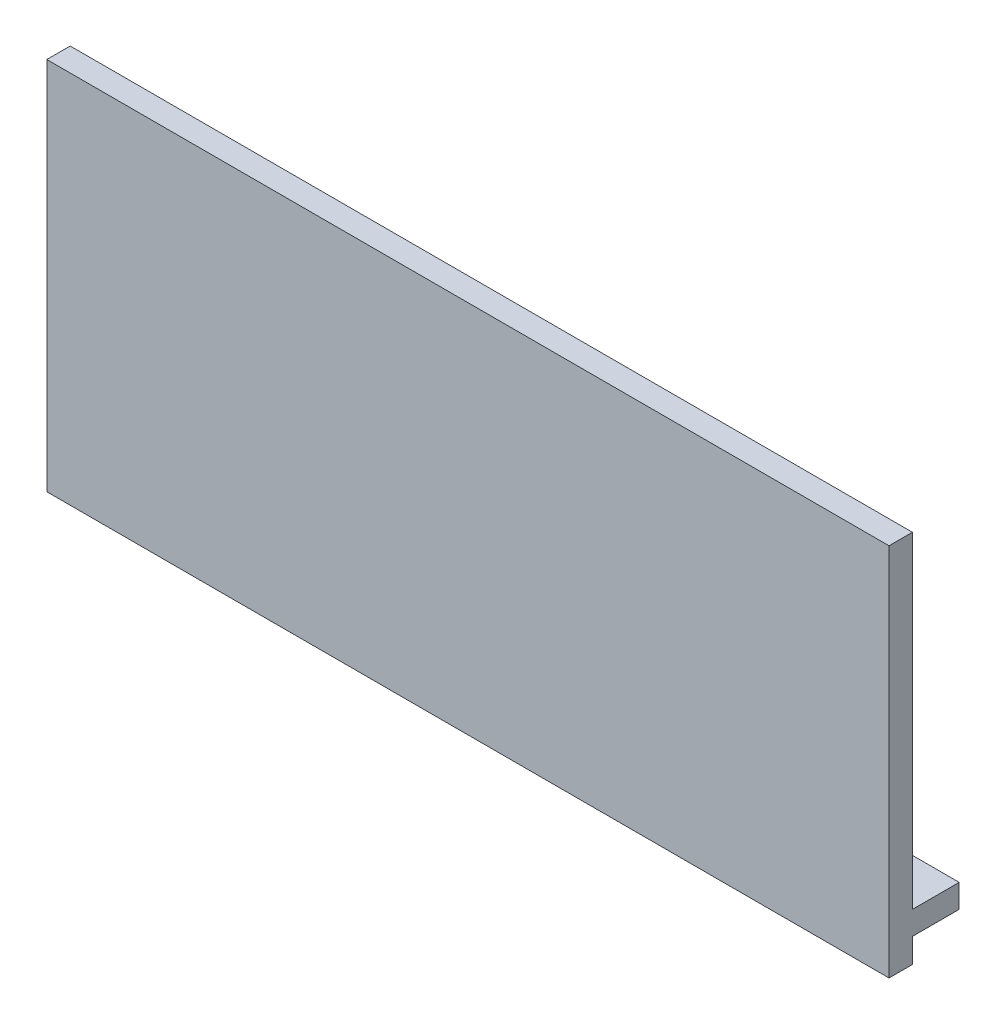
ISO-10303-21;
HEADER;
FILE_DESCRIPTION(('STEP AP214'),'2;1');
FILE_NAME('part.step','',(''),(''),'','','');
FILE_SCHEMA(('AUTOMOTIVE_DESIGN { 1 0 10303 214 1 1 1 1 }'));
ENDSEC;
DATA;
#1=APPLICATION_CONTEXT('core data for automotive mechanical design processes');
#2=APPLICATION_PROTOCOL_DEFINITION('international standard','automotive_design',2000,#1);
#3=PRODUCT_CONTEXT('',#1,'mechanical');
#4=PRODUCT('Part','Part','',(#3));
#5=PRODUCT_RELATED_PRODUCT_CATEGORY('part','',(#4));
#6=PRODUCT_DEFINITION_FORMATION('','',#4);
#7=PRODUCT_DEFINITION_CONTEXT('part definition',#1,'design');
#8=PRODUCT_DEFINITION('design','',#6,#7);
#9=PRODUCT_DEFINITION_SHAPE('','',#8);
#10=(LENGTH_UNIT() NAMED_UNIT(*) SI_UNIT(.MILLI.,.METRE.));
#11=(NAMED_UNIT(*) PLANE_ANGLE_UNIT() SI_UNIT($,.RADIAN.));
#12=(NAMED_UNIT(*) SI_UNIT($,.STERADIAN.) SOLID_ANGLE_UNIT());
#13=UNCERTAINTY_MEASURE_WITH_UNIT(LENGTH_MEASURE(1.E-05),#10,'distance_accuracy_value','');
#14=(GEOMETRIC_REPRESENTATION_CONTEXT(3) GLOBAL_UNCERTAINTY_ASSIGNED_CONTEXT((#13)) GLOBAL_UNIT_ASSIGNED_CONTEXT((#10,
#11,#12)) REPRESENTATION_CONTEXT('',''));
#15=CARTESIAN_POINT('',(0.,0.,0.));
#16=DIRECTION('',(0.,0.,1.));
#17=DIRECTION('',(1.,0.,0.));
#18=AXIS2_PLACEMENT_3D('',#15,#16,#17);
#19=CARTESIAN_POINT('',(0.,0.,0.));
#20=DIRECTION('',(0.,0.,1.));
#21=DIRECTION('',(1.,0.,0.));
#22=AXIS2_PLACEMENT_3D('',#19,#20,#21);
#23=PLANE('',#22);
#24=DIRECTION('',(-1.,0.,0.));
#25=VECTOR('',#24,1.);
#26=CARTESIAN_POINT('',(0.,5.2,0.));
#27=LINE('',#26,#25);
#28=CARTESIAN_POINT('',(180.,5.2,0.));
#29=VERTEX_POINT('',#28);
#30=CARTESIAN_POINT('',(0.,5.2,0.));
#31=VERTEX_POINT('',#30);
#32=EDGE_CURVE('E50',#29,#31,#27,.T.);
#33=ORIENTED_EDGE('',*,*,#32,.F.);
#34=DIRECTION('',(0.,1.,0.));
#35=VECTOR('',#34,1.);
#36=CARTESIAN_POINT('',(180.,0.,0.));
#37=LINE('',#36,#35);
#38=CARTESIAN_POINT('',(180.,0.,0.));
#39=VERTEX_POINT('',#38);
#40=EDGE_CURVE('E152',#39,#29,#37,.T.);
#41=ORIENTED_EDGE('',*,*,#40,.F.);
#42=DIRECTION('',(1.,0.,0.));
#43=VECTOR('',#42,1.);
#44=CARTESIAN_POINT('',(0.,0.,0.));
#45=LINE('',#44,#43);
#46=CARTESIAN_POINT('',(0.,0.,0.));
#47=VERTEX_POINT('',#46);
#48=EDGE_CURVE('E160',#47,#39,#45,.T.);
#49=ORIENTED_EDGE('',*,*,#48,.F.);
#50=DIRECTION('',(0.,1.,0.));
#51=VECTOR('',#50,1.);
#52=CARTESIAN_POINT('',(0.,0.,0.));
#53=LINE('',#52,#51);
#54=EDGE_CURVE('E144',#47,#31,#53,.T.);
#55=ORIENTED_EDGE('',*,*,#54,.T.);
#56=EDGE_LOOP('',(#33,#41,#49,#55));
#57=FACE_BOUND('',#56,.T.);
#58=ADVANCED_FACE('F39',(#57),#23,.F.);
#59=CARTESIAN_POINT('',(0.,80.,5.));
#60=DIRECTION('',(0.,1.,0.));
#61=DIRECTION('',(0.,0.,1.));
#62=AXIS2_PLACEMENT_3D('',#59,#60,#61);
#63=PLANE('',#62);
#64=DIRECTION('',(1.,0.,0.));
#65=VECTOR('',#64,1.);
#66=CARTESIAN_POINT('',(0.,80.,0.));
#67=LINE('',#66,#65);
#68=CARTESIAN_POINT('',(0.,80.,0.));
#69=VERTEX_POINT('',#68);
#70=CARTESIAN_POINT('',(180.,80.,0.));
#71=VERTEX_POINT('',#70);
#72=EDGE_CURVE('E109',#69,#71,#67,.T.);
#73=ORIENTED_EDGE('',*,*,#72,.F.);
#74=DIRECTION('',(0.,0.,-1.));
#75=VECTOR('',#74,1.);
#76=CARTESIAN_POINT('',(0.,80.,5.));
#77=LINE('',#76,#75);
#78=CARTESIAN_POINT('',(0.,80.,5.));
#79=VERTEX_POINT('',#78);
#80=EDGE_CURVE('E159',#79,#69,#77,.T.);
#81=ORIENTED_EDGE('',*,*,#80,.F.);
#82=DIRECTION('',(1.,0.,0.));
#83=VECTOR('',#82,1.);
#84=CARTESIAN_POINT('',(0.,80.,5.));
#85=LINE('',#84,#83);
#86=CARTESIAN_POINT('',(180.,80.,5.));
#87=VERTEX_POINT('',#86);
#88=EDGE_CURVE('E143',#79,#87,#85,.T.);
#89=ORIENTED_EDGE('',*,*,#88,.T.);
#90=DIRECTION('',(0.,0.,-1.));
#91=VECTOR('',#90,1.);
#92=CARTESIAN_POINT('',(180.,80.,5.));
#93=LINE('',#92,#91);
#94=EDGE_CURVE('E155',#87,#71,#93,.T.);
#95=ORIENTED_EDGE('',*,*,#94,.T.);
#96=EDGE_LOOP('',(#73,#81,#89,#95));
#97=FACE_BOUND('',#96,.T.);
#98=ADVANCED_FACE('F41',(#97),#63,.T.);
#99=CARTESIAN_POINT('',(0.,0.,5.));
#100=DIRECTION('',(-1.,0.,0.));
#101=DIRECTION('',(0.,0.,1.));
#102=AXIS2_PLACEMENT_3D('',#99,#100,#101);
#103=PLANE('',#102);
#104=CARTESIAN_POINT('',(0.,10.2,0.));
#105=VERTEX_POINT('',#104);
#106=EDGE_CURVE('E110',#105,#69,#53,.T.);
#107=ORIENTED_EDGE('',*,*,#106,.F.);
#108=DIRECTION('',(0.,0.,-1.));
#109=VECTOR('',#108,1.);
#110=CARTESIAN_POINT('',(0.,10.2,1.));
#111=LINE('',#110,#109);
#112=CARTESIAN_POINT('',(0.,10.2,-10.));
#113=VERTEX_POINT('',#112);
#114=EDGE_CURVE('E99',#105,#113,#111,.T.);
#115=ORIENTED_EDGE('',*,*,#114,.T.);
#116=DIRECTION('',(0.,1.,0.));
#117=VECTOR('',#116,1.);
#118=CARTESIAN_POINT('',(0.,0.,-10.));
#119=LINE('',#118,#117);
#120=CARTESIAN_POINT('',(0.,5.2,-10.));
#121=VERTEX_POINT('',#120);
#122=EDGE_CURVE('E102',#121,#113,#119,.T.);
#123=ORIENTED_EDGE('',*,*,#122,.F.);
#124=DIRECTION('',(0.,0.,-1.));
#125=VECTOR('',#124,1.);
#126=CARTESIAN_POINT('',(0.,5.2,1.));
#127=LINE('',#126,#125);
#128=EDGE_CURVE('E112',#31,#121,#127,.T.);
#129=ORIENTED_EDGE('',*,*,#128,.F.);
#130=ORIENTED_EDGE('',*,*,#54,.F.);
#131=DIRECTION('',(0.,0.,-1.));
#132=VECTOR('',#131,1.);
#133=CARTESIAN_POINT('',(0.,0.,5.));
#134=LINE('',#133,#132);
#135=CARTESIAN_POINT('',(0.,0.,5.));
#136=VERTEX_POINT('',#135);
#137=EDGE_CURVE('E165',#136,#47,#134,.T.);
#138=ORIENTED_EDGE('',*,*,#137,.F.);
#139=DIRECTION('',(0.,1.,0.));
#140=VECTOR('',#139,1.);
#141=CARTESIAN_POINT('',(0.,0.,5.));
#142=LINE('',#141,#140);
#143=EDGE_CURVE('E149',#136,#79,#142,.T.);
#144=ORIENTED_EDGE('',*,*,#143,.T.);
#145=ORIENTED_EDGE('',*,*,#80,.T.);
#146=EDGE_LOOP('',(#107,#115,#123,#129,#130,#138,#144,#145));
#147=FACE_BOUND('',#146,.T.);
#148=ADVANCED_FACE('F105',(#147),#103,.T.);
#149=CARTESIAN_POINT('',(0.,0.,5.));
#150=DIRECTION('',(0.,1.,0.));
#151=DIRECTION('',(0.,0.,1.));
#152=AXIS2_PLACEMENT_3D('',#149,#150,#151);
#153=PLANE('',#152);
#154=ORIENTED_EDGE('',*,*,#48,.T.);
#155=DIRECTION('',(0.,0.,-1.));
#156=VECTOR('',#155,1.);
#157=CARTESIAN_POINT('',(180.,0.,5.));
#158=LINE('',#157,#156);
#159=CARTESIAN_POINT('',(180.,0.,5.));
#160=VERTEX_POINT('',#159);
#161=EDGE_CURVE('E163',#160,#39,#158,.T.);
#162=ORIENTED_EDGE('',*,*,#161,.F.);
#163=DIRECTION('',(1.,0.,0.));
#164=VECTOR('',#163,1.);
#165=CARTESIAN_POINT('',(0.,0.,5.));
#166=LINE('',#165,#164);
#167=EDGE_CURVE('E150',#136,#160,#166,.T.);
#168=ORIENTED_EDGE('',*,*,#167,.F.);
#169=ORIENTED_EDGE('',*,*,#137,.T.);
#170=EDGE_LOOP('',(#154,#162,#168,#169));
#171=FACE_BOUND('',#170,.T.);
#172=ADVANCED_FACE('F178',(#171),#153,.F.);
#173=CARTESIAN_POINT('',(180.,0.,5.));
#174=DIRECTION('',(-1.,0.,0.));
#175=DIRECTION('',(0.,0.,1.));
#176=AXIS2_PLACEMENT_3D('',#173,#174,#175);
#177=PLANE('',#176);
#178=ORIENTED_EDGE('',*,*,#40,.T.);
#179=DIRECTION('',(0.,0.,-1.));
#180=VECTOR('',#179,1.);
#181=CARTESIAN_POINT('',(180.,5.2,1.));
#182=LINE('',#181,#180);
#183=CARTESIAN_POINT('',(180.,5.2,-10.));
#184=VERTEX_POINT('',#183);
#185=EDGE_CURVE('E139',#29,#184,#182,.T.);
#186=ORIENTED_EDGE('',*,*,#185,.T.);
#187=DIRECTION('',(0.,1.,0.));
#188=VECTOR('',#187,1.);
#189=CARTESIAN_POINT('',(180.,0.,-10.));
#190=LINE('',#189,#188);
#191=CARTESIAN_POINT('',(180.,10.2,-10.));
#192=VERTEX_POINT('',#191);
#193=EDGE_CURVE('E134',#184,#192,#190,.T.);
#194=ORIENTED_EDGE('',*,*,#193,.T.);
#195=DIRECTION('',(0.,0.,-1.));
#196=VECTOR('',#195,1.);
#197=CARTESIAN_POINT('',(180.,10.2,1.));
#198=LINE('',#197,#196);
#199=CARTESIAN_POINT('',(180.,10.2,0.));
#200=VERTEX_POINT('',#199);
#201=EDGE_CURVE('E123',#200,#192,#198,.T.);
#202=ORIENTED_EDGE('',*,*,#201,.F.);
#203=EDGE_CURVE('E60',#200,#71,#37,.T.);
#204=ORIENTED_EDGE('',*,*,#203,.T.);
#205=ORIENTED_EDGE('',*,*,#94,.F.);
#206=DIRECTION('',(0.,1.,0.));
#207=VECTOR('',#206,1.);
#208=CARTESIAN_POINT('',(180.,0.,5.));
#209=LINE('',#208,#207);
#210=EDGE_CURVE('E145',#160,#87,#209,.T.);
#211=ORIENTED_EDGE('',*,*,#210,.F.);
#212=ORIENTED_EDGE('',*,*,#161,.T.);
#213=EDGE_LOOP('',(#178,#186,#194,#202,#204,#205,#211,#212));
#214=FACE_BOUND('',#213,.T.);
#215=ADVANCED_FACE('F185',(#214),#177,.F.);
#216=CARTESIAN_POINT('',(0.,0.,5.));
#217=DIRECTION('',(0.,0.,1.));
#218=DIRECTION('',(1.,0.,0.));
#219=AXIS2_PLACEMENT_3D('',#216,#217,#218);
#220=PLANE('',#219);
#221=ORIENTED_EDGE('',*,*,#88,.F.);
#222=ORIENTED_EDGE('',*,*,#143,.F.);
#223=ORIENTED_EDGE('',*,*,#167,.T.);
#224=ORIENTED_EDGE('',*,*,#210,.T.);
#225=EDGE_LOOP('',(#221,#222,#223,#224));
#226=FACE_BOUND('',#225,.T.);
#227=ADVANCED_FACE('F188',(#226),#220,.T.);
#228=ORIENTED_EDGE('',*,*,#203,.F.);
#229=DIRECTION('',(-1.,0.,0.));
#230=VECTOR('',#229,1.);
#231=CARTESIAN_POINT('',(0.,10.2,0.));
#232=LINE('',#231,#230);
#233=EDGE_CURVE('E11',#200,#105,#232,.T.);
#234=ORIENTED_EDGE('',*,*,#233,.T.);
#235=ORIENTED_EDGE('',*,*,#106,.T.);
#236=ORIENTED_EDGE('',*,*,#72,.T.);
#237=EDGE_LOOP('',(#228,#234,#235,#236));
#238=FACE_BOUND('',#237,.T.);
#239=ADVANCED_FACE('F189',(#238),#23,.F.);
#240=CARTESIAN_POINT('',(0.,10.2,1.));
#241=DIRECTION('',(0.,1.,0.));
#242=DIRECTION('',(0.,0.,1.));
#243=AXIS2_PLACEMENT_3D('',#240,#241,#242);
#244=PLANE('',#243);
#245=CARTESIAN_POINT('',(165.,10.2,-5.00000000000012));
#246=DIRECTION('',(0.,1.,0.));
#247=DIRECTION('',(0.,0.,1.));
#248=AXIS2_PLACEMENT_3D('',#245,#246,#247);
#249=CIRCLE('',#248,1.4);
#250=CARTESIAN_POINT('',(165.,10.2,-3.60000000000011));
#251=VERTEX_POINT('',#250);
#252=EDGE_CURVE('E126',#251,#251,#249,.T.);
#253=ORIENTED_EDGE('',*,*,#252,.F.);
#254=EDGE_LOOP('',(#253));
#255=FACE_BOUND('',#254,.T.);
#256=CARTESIAN_POINT('',(90.0000000000001,10.2,-5.00000000000009));
#257=DIRECTION('',(0.,1.,0.));
#258=DIRECTION('',(0.,0.,1.));
#259=AXIS2_PLACEMENT_3D('',#256,#257,#258);
#260=CIRCLE('',#259,1.4);
#261=CARTESIAN_POINT('',(90.0000000000001,10.2,-3.60000000000009));
#262=VERTEX_POINT('',#261);
#263=EDGE_CURVE('E293',#262,#262,#260,.T.);
#264=ORIENTED_EDGE('',*,*,#263,.F.);
#265=EDGE_LOOP('',(#264));
#266=FACE_BOUND('',#265,.T.);
#267=CARTESIAN_POINT('',(15.,10.2,-5.00000000000006));
#268=DIRECTION('',(0.,1.,0.));
#269=DIRECTION('',(0.,0.,1.));
#270=AXIS2_PLACEMENT_3D('',#267,#268,#269);
#271=CIRCLE('',#270,1.4);
#272=CARTESIAN_POINT('',(15.,10.2,-3.60000000000006));
#273=VERTEX_POINT('',#272);
#274=EDGE_CURVE('E133',#273,#273,#271,.T.);
#275=ORIENTED_EDGE('',*,*,#274,.F.);
#276=EDGE_LOOP('',(#275));
#277=FACE_BOUND('',#276,.T.);
#278=ORIENTED_EDGE('',*,*,#233,.F.);
#279=ORIENTED_EDGE('',*,*,#201,.T.);
#280=DIRECTION('',(1.,0.,0.));
#281=VECTOR('',#280,1.);
#282=CARTESIAN_POINT('',(0.,10.2,-10.));
#283=LINE('',#282,#281);
#284=EDGE_CURVE('E120',#113,#192,#283,.T.);
#285=ORIENTED_EDGE('',*,*,#284,.F.);
#286=ORIENTED_EDGE('',*,*,#114,.F.);
#287=EDGE_LOOP('',(#278,#279,#285,#286));
#288=FACE_BOUND('',#287,.T.);
#289=ADVANCED_FACE('F122',(#255,#266,#277,#288),#244,.T.);
#290=CARTESIAN_POINT('',(0.,5.2,1.));
#291=DIRECTION('',(0.,1.,0.));
#292=DIRECTION('',(0.,0.,1.));
#293=AXIS2_PLACEMENT_3D('',#290,#291,#292);
#294=PLANE('',#293);
#295=CARTESIAN_POINT('',(165.,5.2,-5.00000000000012));
#296=DIRECTION('',(0.,1.,0.));
#297=DIRECTION('',(0.,0.,1.));
#298=AXIS2_PLACEMENT_3D('',#295,#296,#297);
#299=CIRCLE('',#298,1.4);
#300=CARTESIAN_POINT('',(165.,5.2,-3.60000000000011));
#301=VERTEX_POINT('',#300);
#302=EDGE_CURVE('E125',#301,#301,#299,.F.);
#303=ORIENTED_EDGE('',*,*,#302,.F.);
#304=EDGE_LOOP('',(#303));
#305=FACE_BOUND('',#304,.T.);
#306=CARTESIAN_POINT('',(90.0000000000001,5.2,-5.00000000000009));
#307=DIRECTION('',(0.,1.,0.));
#308=DIRECTION('',(0.,0.,1.));
#309=AXIS2_PLACEMENT_3D('',#306,#307,#308);
#310=CIRCLE('',#309,1.4);
#311=CARTESIAN_POINT('',(90.0000000000001,5.2,-3.60000000000009));
#312=VERTEX_POINT('',#311);
#313=EDGE_CURVE('E289',#312,#312,#310,.F.);
#314=ORIENTED_EDGE('',*,*,#313,.F.);
#315=EDGE_LOOP('',(#314));
#316=FACE_BOUND('',#315,.T.);
#317=CARTESIAN_POINT('',(15.,5.2,-5.00000000000006));
#318=DIRECTION('',(0.,1.,0.));
#319=DIRECTION('',(0.,0.,1.));
#320=AXIS2_PLACEMENT_3D('',#317,#318,#319);
#321=CIRCLE('',#320,1.4);
#322=CARTESIAN_POINT('',(15.,5.2,-3.60000000000006));
#323=VERTEX_POINT('',#322);
#324=EDGE_CURVE('E292',#323,#323,#321,.F.);
#325=ORIENTED_EDGE('',*,*,#324,.F.);
#326=EDGE_LOOP('',(#325));
#327=FACE_BOUND('',#326,.T.);
#328=ORIENTED_EDGE('',*,*,#185,.F.);
#329=ORIENTED_EDGE('',*,*,#32,.T.);
#330=ORIENTED_EDGE('',*,*,#128,.T.);
#331=DIRECTION('',(1.,0.,0.));
#332=VECTOR('',#331,1.);
#333=CARTESIAN_POINT('',(0.,5.2,-10.));
#334=LINE('',#333,#332);
#335=EDGE_CURVE('E119',#121,#184,#334,.T.);
#336=ORIENTED_EDGE('',*,*,#335,.T.);
#337=EDGE_LOOP('',(#328,#329,#330,#336));
#338=FACE_BOUND('',#337,.T.);
#339=ADVANCED_FACE('F173',(#305,#316,#327,#338),#294,.F.);
#340=CARTESIAN_POINT('',(0.,0.,-10.));
#341=DIRECTION('',(0.,0.,1.));
#342=DIRECTION('',(1.,0.,0.));
#343=AXIS2_PLACEMENT_3D('',#340,#341,#342);
#344=PLANE('',#343);
#345=ORIENTED_EDGE('',*,*,#284,.T.);
#346=ORIENTED_EDGE('',*,*,#193,.F.);
#347=ORIENTED_EDGE('',*,*,#335,.F.);
#348=ORIENTED_EDGE('',*,*,#122,.T.);
#349=EDGE_LOOP('',(#345,#346,#347,#348));
#350=FACE_BOUND('',#349,.T.);
#351=ADVANCED_FACE('F113',(#350),#344,.F.);
#352=CARTESIAN_POINT('',(15.,-0.000999999999999265,-5.00000000000006));
#353=DIRECTION('',(0.,1.,0.));
#354=DIRECTION('',(0.,0.,1.));
#355=AXIS2_PLACEMENT_3D('',#352,#353,#354);
#356=CYLINDRICAL_SURFACE('',#355,1.4);
#357=ORIENTED_EDGE('',*,*,#274,.T.);
#358=EDGE_LOOP('',(#357));
#359=FACE_BOUND('',#358,.T.);
#360=ORIENTED_EDGE('',*,*,#324,.T.);
#361=EDGE_LOOP('',(#360));
#362=FACE_BOUND('',#361,.T.);
#363=ADVANCED_FACE('F248',(#359,#362),#356,.F.);
#364=CARTESIAN_POINT('',(90.0000000000001,-0.000999999999999265,-5.00000000000009));
#365=DIRECTION('',(0.,1.,0.));
#366=DIRECTION('',(0.,0.,1.));
#367=AXIS2_PLACEMENT_3D('',#364,#365,#366);
#368=CYLINDRICAL_SURFACE('',#367,1.4);
#369=ORIENTED_EDGE('',*,*,#263,.T.);
#370=EDGE_LOOP('',(#369));
#371=FACE_BOUND('',#370,.T.);
#372=ORIENTED_EDGE('',*,*,#313,.T.);
#373=EDGE_LOOP('',(#372));
#374=FACE_BOUND('',#373,.T.);
#375=ADVANCED_FACE('F260',(#371,#374),#368,.F.);
#376=CARTESIAN_POINT('',(165.,-0.000999999999999265,-5.00000000000012));
#377=DIRECTION('',(0.,1.,0.));
#378=DIRECTION('',(0.,0.,1.));
#379=AXIS2_PLACEMENT_3D('',#376,#377,#378);
#380=CYLINDRICAL_SURFACE('',#379,1.4);
#381=ORIENTED_EDGE('',*,*,#252,.T.);
#382=EDGE_LOOP('',(#381));
#383=FACE_BOUND('',#382,.T.);
#384=ORIENTED_EDGE('',*,*,#302,.T.);
#385=EDGE_LOOP('',(#384));
#386=FACE_BOUND('',#385,.T.);
#387=ADVANCED_FACE('F270',(#383,#386),#380,.F.);
#388=CLOSED_SHELL('',(#58,#98,#148,#172,#215,#227,#239,#289,#339,#351,#363,#375,#387));
#389=MANIFOLD_SOLID_BREP('B2',#388);
#390=ADVANCED_BREP_SHAPE_REPRESENTATION('',(#18,#389),#14);
#391=SHAPE_DEFINITION_REPRESENTATION(#9,#390);
ENDSEC;
END-ISO-10303-21;
